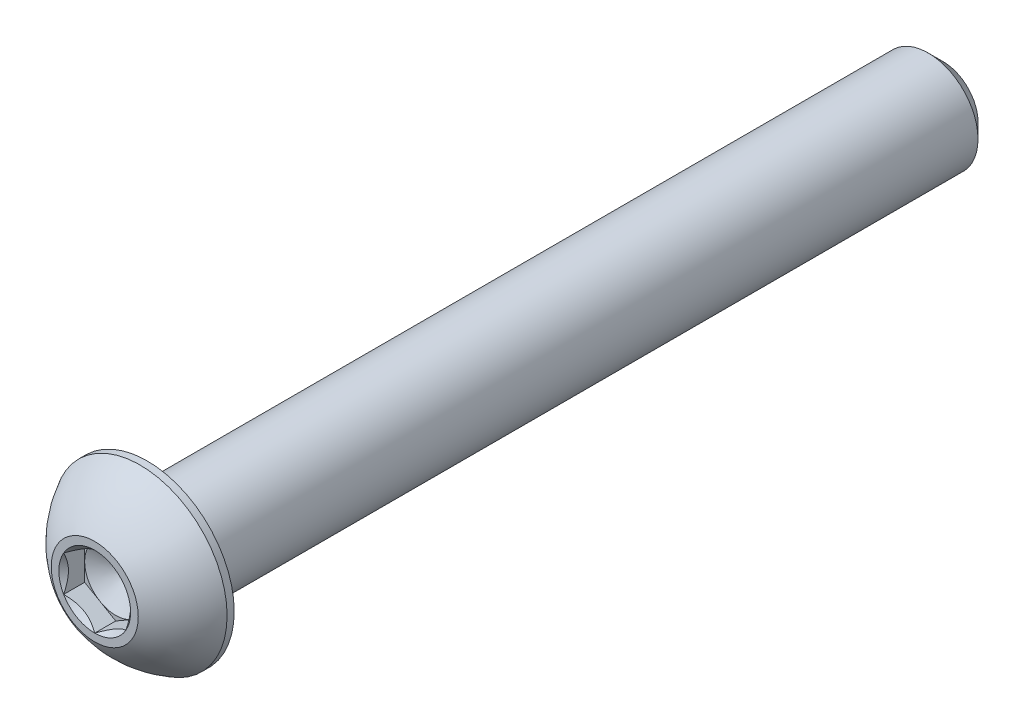
ISO-10303-21;
HEADER;
FILE_DESCRIPTION(('STEP AP214'),'2;1');
FILE_NAME('part.step','',(''),(''),'','','');
FILE_SCHEMA(('AUTOMOTIVE_DESIGN { 1 0 10303 214 1 1 1 1 }'));
ENDSEC;
DATA;
#1=APPLICATION_CONTEXT('core data for automotive mechanical design processes');
#2=APPLICATION_PROTOCOL_DEFINITION('international standard','automotive_design',2000,#1);
#3=PRODUCT_CONTEXT('',#1,'mechanical');
#4=PRODUCT('Part','Part','',(#3));
#5=PRODUCT_RELATED_PRODUCT_CATEGORY('part','',(#4));
#6=PRODUCT_DEFINITION_FORMATION('','',#4);
#7=PRODUCT_DEFINITION_CONTEXT('part definition',#1,'design');
#8=PRODUCT_DEFINITION('design','',#6,#7);
#9=PRODUCT_DEFINITION_SHAPE('','',#8);
#10=(LENGTH_UNIT() NAMED_UNIT(*) SI_UNIT(.MILLI.,.METRE.));
#11=(NAMED_UNIT(*) PLANE_ANGLE_UNIT() SI_UNIT($,.RADIAN.));
#12=(NAMED_UNIT(*) SI_UNIT($,.STERADIAN.) SOLID_ANGLE_UNIT());
#13=UNCERTAINTY_MEASURE_WITH_UNIT(LENGTH_MEASURE(1.E-05),#10,'distance_accuracy_value','');
#14=(GEOMETRIC_REPRESENTATION_CONTEXT(3) GLOBAL_UNCERTAINTY_ASSIGNED_CONTEXT((#13)) GLOBAL_UNIT_ASSIGNED_CONTEXT((#10,
#11,#12)) REPRESENTATION_CONTEXT('',''));
#15=CARTESIAN_POINT('',(0.,0.,0.));
#16=DIRECTION('',(0.,0.,1.));
#17=DIRECTION('',(1.,0.,0.));
#18=AXIS2_PLACEMENT_3D('',#15,#16,#17);
#19=CARTESIAN_POINT('',(0.,1.984375,27.0764));
#20=DIRECTION('',(0.,0.,-1.));
#21=DIRECTION('',(-1.,0.,0.));
#22=AXIS2_PLACEMENT_3D('',#19,#20,#21);
#23=PLANE('',#22);
#24=CARTESIAN_POINT('',(0.,0.,27.0764));
#25=DIRECTION('',(0.,0.,1.));
#26=DIRECTION('',(1.,0.,0.));
#27=AXIS2_PLACEMENT_3D('',#24,#25,#26);
#28=CIRCLE('',#27,2.778125);
#29=CARTESIAN_POINT('',(2.778125,0.,27.0764));
#30=VERTEX_POINT('',#29);
#31=EDGE_CURVE('E169',#30,#30,#28,.T.);
#32=ORIENTED_EDGE('',*,*,#31,.T.);
#33=EDGE_LOOP('',(#32));
#34=FACE_BOUND('',#33,.T.);
#35=CARTESIAN_POINT('',(0.,0.,27.0764));
#36=DIRECTION('',(0.,0.,1.));
#37=DIRECTION('',(1.,0.,0.));
#38=AXIS2_PLACEMENT_3D('',#35,#36,#37);
#39=CIRCLE('',#38,2.29135888084633);
#40=CARTESIAN_POINT('',(0.,2.29135888084633,27.0764));
#41=VERTEX_POINT('',#40);
#42=CARTESIAN_POINT('',(-1.984375,1.14567944042316,27.0764));
#43=VERTEX_POINT('',#42);
#44=EDGE_CURVE('E123',#41,#43,#39,.T.);
#45=ORIENTED_EDGE('',*,*,#44,.F.);
#46=CARTESIAN_POINT('',(0.,0.,27.0764));
#47=DIRECTION('',(0.,0.,1.));
#48=DIRECTION('',(1.,0.,0.));
#49=AXIS2_PLACEMENT_3D('',#46,#47,#48);
#50=CIRCLE('',#49,2.29135888084633);
#51=CARTESIAN_POINT('',(1.984375,1.14567944042317,27.0764));
#52=VERTEX_POINT('',#51);
#53=EDGE_CURVE('E108',#52,#41,#50,.T.);
#54=ORIENTED_EDGE('',*,*,#53,.F.);
#55=CARTESIAN_POINT('',(0.,0.,27.0764));
#56=DIRECTION('',(0.,0.,1.));
#57=DIRECTION('',(1.,0.,0.));
#58=AXIS2_PLACEMENT_3D('',#55,#56,#57);
#59=CIRCLE('',#58,2.29135888084633);
#60=CARTESIAN_POINT('',(1.984375,-1.14567944042317,27.0764));
#61=VERTEX_POINT('',#60);
#62=EDGE_CURVE('E119',#61,#52,#59,.T.);
#63=ORIENTED_EDGE('',*,*,#62,.F.);
#64=CARTESIAN_POINT('',(0.,0.,27.0764));
#65=DIRECTION('',(0.,0.,1.));
#66=DIRECTION('',(1.,0.,0.));
#67=AXIS2_PLACEMENT_3D('',#64,#65,#66);
#68=CIRCLE('',#67,2.29135888084633);
#69=CARTESIAN_POINT('',(0.,-2.29135888084633,27.0764));
#70=VERTEX_POINT('',#69);
#71=EDGE_CURVE('E140',#70,#61,#68,.T.);
#72=ORIENTED_EDGE('',*,*,#71,.F.);
#73=CARTESIAN_POINT('',(0.,0.,27.0764));
#74=DIRECTION('',(0.,0.,1.));
#75=DIRECTION('',(1.,0.,0.));
#76=AXIS2_PLACEMENT_3D('',#73,#74,#75);
#77=CIRCLE('',#76,2.29135888084633);
#78=CARTESIAN_POINT('',(-1.984375,-1.14567944042316,27.0764));
#79=VERTEX_POINT('',#78);
#80=EDGE_CURVE('E396',#79,#70,#77,.T.);
#81=ORIENTED_EDGE('',*,*,#80,.F.);
#82=CARTESIAN_POINT('',(0.,0.,27.0764));
#83=DIRECTION('',(0.,0.,1.));
#84=DIRECTION('',(1.,0.,0.));
#85=AXIS2_PLACEMENT_3D('',#82,#83,#84);
#86=CIRCLE('',#85,2.29135888084633);
#87=EDGE_CURVE('E405',#43,#79,#86,.T.);
#88=ORIENTED_EDGE('',*,*,#87,.F.);
#89=EDGE_LOOP('',(#45,#54,#63,#72,#81,#88));
#90=FACE_BOUND('',#89,.T.);
#91=ADVANCED_FACE('F35',(#34,#90),#23,.F.);
#92=CARTESIAN_POINT('',(0.,0.,-27.0764));
#93=DIRECTION('',(0.,0.,1.));
#94=DIRECTION('',(1.,0.,0.));
#95=AXIS2_PLACEMENT_3D('',#92,#93,#94);
#96=CONICAL_SURFACE('',#95,2.2225,0.785398163397447);
#97=CARTESIAN_POINT('',(0.,0.,-26.1239));
#98=DIRECTION('',(0.,0.,1.));
#99=DIRECTION('',(1.,0.,0.));
#100=AXIS2_PLACEMENT_3D('',#97,#98,#99);
#101=CIRCLE('',#100,3.175);
#102=CARTESIAN_POINT('',(3.175,0.,-26.1239));
#103=VERTEX_POINT('',#102);
#104=EDGE_CURVE('E11',#103,#103,#101,.T.);
#105=ORIENTED_EDGE('',*,*,#104,.F.);
#106=EDGE_LOOP('',(#105));
#107=FACE_BOUND('',#106,.T.);
#108=CARTESIAN_POINT('',(0.,0.,-27.0764));
#109=DIRECTION('',(0.,0.,1.));
#110=DIRECTION('',(1.,0.,0.));
#111=AXIS2_PLACEMENT_3D('',#108,#109,#110);
#112=CIRCLE('',#111,2.2225);
#113=CARTESIAN_POINT('',(2.2225,0.,-27.0764));
#114=VERTEX_POINT('',#113);
#115=EDGE_CURVE('E162',#114,#114,#112,.T.);
#116=ORIENTED_EDGE('',*,*,#115,.T.);
#117=EDGE_LOOP('',(#116));
#118=FACE_BOUND('',#117,.T.);
#119=ADVANCED_FACE('F37',(#107,#118),#96,.T.);
#120=CARTESIAN_POINT('',(0.,0.,27.0764));
#121=DIRECTION('',(0.,0.,1.));
#122=DIRECTION('',(1.,0.,0.));
#123=AXIS2_PLACEMENT_3D('',#120,#121,#122);
#124=CYLINDRICAL_SURFACE('',#123,3.175);
#125=CARTESIAN_POINT('',(0.,0.,23.7236));
#126=DIRECTION('',(0.,0.,1.));
#127=DIRECTION('',(1.,0.,0.));
#128=AXIS2_PLACEMENT_3D('',#125,#126,#127);
#129=CIRCLE('',#128,3.175);
#130=CARTESIAN_POINT('',(3.175,0.,23.7236));
#131=VERTEX_POINT('',#130);
#132=EDGE_CURVE('E43',#131,#131,#129,.T.);
#133=ORIENTED_EDGE('',*,*,#132,.F.);
#134=EDGE_LOOP('',(#133));
#135=FACE_BOUND('',#134,.T.);
#136=ORIENTED_EDGE('',*,*,#104,.T.);
#137=EDGE_LOOP('',(#136));
#138=FACE_BOUND('',#137,.T.);
#139=ADVANCED_FACE('F183',(#135,#138),#124,.T.);
#140=CARTESIAN_POINT('',(0.,5.5499,23.7236));
#141=DIRECTION('',(0.,0.,1.));
#142=DIRECTION('',(1.,0.,0.));
#143=AXIS2_PLACEMENT_3D('',#140,#141,#142);
#144=PLANE('',#143);
#145=CARTESIAN_POINT('',(0.,0.,23.7236));
#146=DIRECTION('',(0.,0.,1.));
#147=DIRECTION('',(1.,0.,0.));
#148=AXIS2_PLACEMENT_3D('',#145,#146,#147);
#149=CIRCLE('',#148,5.5499);
#150=CARTESIAN_POINT('',(5.5499,0.,23.7236));
#151=VERTEX_POINT('',#150);
#152=EDGE_CURVE('E176',#151,#151,#149,.T.);
#153=ORIENTED_EDGE('',*,*,#152,.F.);
#154=EDGE_LOOP('',(#153));
#155=FACE_BOUND('',#154,.T.);
#156=ORIENTED_EDGE('',*,*,#132,.T.);
#157=EDGE_LOOP('',(#156));
#158=FACE_BOUND('',#157,.T.);
#159=ADVANCED_FACE('F181',(#155,#158),#144,.F.);
#160=CARTESIAN_POINT('',(0.,0.,27.0764));
#161=DIRECTION('',(0.,0.,1.));
#162=DIRECTION('',(1.,0.,0.));
#163=AXIS2_PLACEMENT_3D('',#160,#161,#162);
#164=CYLINDRICAL_SURFACE('',#163,5.5499);
#165=CARTESIAN_POINT('',(0.,0.,24.1771714285714));
#166=DIRECTION('',(0.,0.,1.));
#167=DIRECTION('',(1.,0.,0.));
#168=AXIS2_PLACEMENT_3D('',#165,#166,#167);
#169=CIRCLE('',#168,5.5499);
#170=CARTESIAN_POINT('',(5.5499,0.,24.1771714285714));
#171=VERTEX_POINT('',#170);
#172=EDGE_CURVE('E173',#171,#171,#169,.T.);
#173=ORIENTED_EDGE('',*,*,#172,.F.);
#174=EDGE_LOOP('',(#173));
#175=FACE_BOUND('',#174,.T.);
#176=ORIENTED_EDGE('',*,*,#152,.T.);
#177=EDGE_LOOP('',(#176));
#178=FACE_BOUND('',#177,.T.);
#179=ADVANCED_FACE('F203',(#175,#178),#164,.T.);
#180=CARTESIAN_POINT('',(0.,0.,20.8835738300144));
#181=DIRECTION('',(0.,0.,1.));
#182=DIRECTION('',(1.,0.,0.));
#183=AXIS2_PLACEMENT_3D('',#180,#181,#182);
#184=DEGENERATE_TOROIDAL_SURFACE('',#183,0.797304856285753,7.15085971257149,.F.);
#185=ORIENTED_EDGE('',*,*,#31,.F.);
#186=EDGE_LOOP('',(#185));
#187=FACE_BOUND('',#186,.T.);
#188=ORIENTED_EDGE('',*,*,#172,.T.);
#189=EDGE_LOOP('',(#188));
#190=FACE_BOUND('',#189,.T.);
#191=ADVANCED_FACE('F194',(#187,#190),#184,.F.);
#192=CARTESIAN_POINT('',(0.,2.2225,-27.0764));
#193=DIRECTION('',(0.,0.,1.));
#194=DIRECTION('',(1.,0.,0.));
#195=AXIS2_PLACEMENT_3D('',#192,#193,#194);
#196=PLANE('',#195);
#197=ORIENTED_EDGE('',*,*,#115,.F.);
#198=EDGE_LOOP('',(#197));
#199=FACE_BOUND('',#198,.T.);
#200=ADVANCED_FACE('F192',(#199),#196,.F.);
#201=CARTESIAN_POINT('',(1.984375,1.14567944042317,27.0764));
#202=DIRECTION('',(-0.499999999999999,-0.866025403784439,0.));
#203=DIRECTION('',(0.866025403784439,-0.499999999999999,0.));
#204=AXIS2_PLACEMENT_3D('',#201,#202,#203);
#205=PLANE('',#204);
#206=CARTESIAN_POINT('',(1.984575,1.14556397036933,27.0765154787818));
#207=CARTESIAN_POINT('',(1.9163590048332,1.18494849354192,27.0371628522639));
#208=CARTESIAN_POINT('',(1.84700231489303,1.22499159714897,27.0001213104462));
#209=CARTESIAN_POINT('',(1.70557619954781,1.30664400291398,26.9322988584233));
#210=CARTESIAN_POINT('',(1.63349332126322,1.34826107209555,26.9015556890918));
#211=CARTESIAN_POINT('',(1.48814160273399,1.43217992591557,26.8488918888112));
#212=CARTESIAN_POINT('',(1.41490978751306,1.47446033414663,26.82683887588));
#213=CARTESIAN_POINT('',(1.26683381740529,1.55995203534886,26.7928614929439));
#214=CARTESIAN_POINT('',(1.19199418724658,1.60316071596705,26.7809117560917));
#215=CARTESIAN_POINT('',(1.06301458545618,1.6776271237807,26.7701300990819));
#216=CARTESIAN_POINT('',(1.00904128422756,1.7087886237741,26.7685338990591));
#217=CARTESIAN_POINT('',(0.901182881480199,1.77106070163465,26.7712218388653));
#218=CARTESIAN_POINT('',(0.847297817514476,1.80217125782056,26.7755080403405));
#219=CARTESIAN_POINT('',(0.740036461751395,1.86409863044402,26.7897168730135));
#220=CARTESIAN_POINT('',(0.686660807239859,1.89491507894443,26.7996458104523));
#221=CARTESIAN_POINT('',(0.580832482591103,1.95601509066827,26.8245950842745));
#222=CARTESIAN_POINT('',(0.528379742028898,1.9862986945516,26.8396150303895));
#223=CARTESIAN_POINT('',(0.394017661036351,2.06387267818152,26.8842078516357));
#224=CARTESIAN_POINT('',(0.312941642841675,2.11068193911104,26.9171429959383));
#225=CARTESIAN_POINT('',(0.193726693270159,2.17951072233758,26.9727424412022));
#226=CARTESIAN_POINT('',(0.154440075613997,2.20219286161692,26.9922775920519));
#227=CARTESIAN_POINT('',(0.0765946381319456,2.24713694590237,27.0331287381194));
#228=CARTESIAN_POINT('',(0.0380353888983002,2.26939913882716,27.0544436395683));
#229=CARTESIAN_POINT('',(-0.000200000000001396,2.29147435090016,27.0765154787818));
#230=B_SPLINE_CURVE_WITH_KNOTS('',3,(#206,#207,#208,#209,#210,#211,#212,#213,#214,#215,#216,
#217,#218,#219,#220,#221,#222,#223,#224,#225,#226,#227,#228,#229),.UNSPECIFIED.,.F.,.F.,(4,2,2,
2,2,2,2,2,2,2,2,4),(0.,0.264339630306627,0.530219665093694,0.791876416371458,1.05287424418109,
1.239639843932,1.42647091743852,1.61351120244034,1.8005371524754,2.09764209964316,
2.24579179873714,2.39385111134157),.UNSPECIFIED.);
#231=EDGE_CURVE('E105',#52,#41,#230,.T.);
#232=ORIENTED_EDGE('',*,*,#231,.T.);
#233=DIRECTION('',(0.,0.,-1.));
#234=VECTOR('',#233,1.);
#235=CARTESIAN_POINT('',(0.,2.29135888084633,27.0764));
#236=LINE('',#235,#234);
#237=CARTESIAN_POINT('',(0.,2.29135888084633,25.73528));
#238=VERTEX_POINT('',#237);
#239=EDGE_CURVE('E160',#41,#238,#236,.T.);
#240=ORIENTED_EDGE('',*,*,#239,.T.);
#241=DIRECTION('',(-0.866025403784439,0.499999999999999,0.));
#242=VECTOR('',#241,1.);
#243=CARTESIAN_POINT('',(1.984375,1.14567944042317,25.73528));
#244=LINE('',#243,#242);
#245=CARTESIAN_POINT('',(0.992187499999998,1.71851916063475,25.73528));
#246=VERTEX_POINT('',#245);
#247=EDGE_CURVE('E432',#246,#238,#244,.T.);
#248=ORIENTED_EDGE('',*,*,#247,.F.);
#249=CARTESIAN_POINT('',(1.984375,1.14567944042317,25.73528));
#250=VERTEX_POINT('',#249);
#251=EDGE_CURVE('E50',#250,#246,#244,.T.);
#252=ORIENTED_EDGE('',*,*,#251,.F.);
#253=DIRECTION('',(0.,0.,-1.));
#254=VECTOR('',#253,1.);
#255=CARTESIAN_POINT('',(1.984375,1.14567944042317,27.0764));
#256=LINE('',#255,#254);
#257=EDGE_CURVE('E136',#52,#250,#256,.T.);
#258=ORIENTED_EDGE('',*,*,#257,.F.);
#259=EDGE_LOOP('',(#232,#240,#248,#252,#258));
#260=FACE_BOUND('',#259,.T.);
#261=ADVANCED_FACE('F142',(#260),#205,.T.);
#262=CARTESIAN_POINT('',(0.,2.29135888084633,27.0764));
#263=DIRECTION('',(0.5,-0.866025403784438,0.));
#264=DIRECTION('',(0.866025403784438,0.5,0.));
#265=AXIS2_PLACEMENT_3D('',#262,#263,#264);
#266=PLANE('',#265);
#267=CARTESIAN_POINT('',(0.000199999999998332,2.29147435090016,27.0765154787818));
#268=CARTESIAN_POINT('',(-0.0680159951668041,2.25208982772757,27.0371628522639));
#269=CARTESIAN_POINT('',(-0.137372685106968,2.21204672412052,27.0001213104462));
#270=CARTESIAN_POINT('',(-0.278798800452189,2.13039431835551,26.9322988584233));
#271=CARTESIAN_POINT('',(-0.350881678736784,2.08877724917394,26.9015556890918));
#272=CARTESIAN_POINT('',(-0.496233397266005,2.00485839535392,26.8488918888112));
#273=CARTESIAN_POINT('',(-0.569465212486939,1.96257798712287,26.82683887588));
#274=CARTESIAN_POINT('',(-0.717541182594706,1.87708628592063,26.7928614929439));
#275=CARTESIAN_POINT('',(-0.792380812753424,1.83387760530244,26.7809117560917));
#276=CARTESIAN_POINT('',(-0.921360414543815,1.75941119748879,26.7701300990819));
#277=CARTESIAN_POINT('',(-0.975333715772442,1.72824969749539,26.7685338990591));
#278=CARTESIAN_POINT('',(-1.0831921185198,1.66597761963484,26.7712218388653));
#279=CARTESIAN_POINT('',(-1.13707718248552,1.63486706344893,26.7755080403405));
#280=CARTESIAN_POINT('',(-1.2443385382486,1.57293969082547,26.7897168730135));
#281=CARTESIAN_POINT('',(-1.29771419276014,1.54212324232506,26.7996458104523));
#282=CARTESIAN_POINT('',(-1.4035425174089,1.48102323060122,26.8245950842745));
#283=CARTESIAN_POINT('',(-1.4559952579711,1.45073962671789,26.8396150303895));
#284=CARTESIAN_POINT('',(-1.59035733896365,1.37316564308797,26.8842078516357));
#285=CARTESIAN_POINT('',(-1.67143335715832,1.32635638215845,26.9171429959383));
#286=CARTESIAN_POINT('',(-1.79064830672984,1.25752759893191,26.9727424412022));
#287=CARTESIAN_POINT('',(-1.829934924386,1.23484545965257,26.9922775920519));
#288=CARTESIAN_POINT('',(-1.90778036186805,1.18990137536712,27.0331287381194));
#289=CARTESIAN_POINT('',(-1.9463396111017,1.16763918244233,27.0544436395683));
#290=CARTESIAN_POINT('',(-1.984575,1.14556397036933,27.0765154787818));
#291=B_SPLINE_CURVE_WITH_KNOTS('',3,(#267,#268,#269,#270,#271,#272,#273,#274,#275,#276,#277,
#278,#279,#280,#281,#282,#283,#284,#285,#286,#287,#288,#289,#290),.UNSPECIFIED.,.F.,.F.,(4,2,2,
2,2,2,2,2,2,2,2,4),(0.,0.264339630306627,0.530219665093694,0.791876416371458,1.05287424418109,
1.239639843932,1.42647091743852,1.61351120244034,1.8005371524754,2.09764209964316,
2.24579179873714,2.39385111134157),.UNSPECIFIED.);
#292=EDGE_CURVE('E420',#41,#43,#291,.T.);
#293=ORIENTED_EDGE('',*,*,#292,.T.);
#294=DIRECTION('',(0.,0.,-1.));
#295=VECTOR('',#294,1.);
#296=CARTESIAN_POINT('',(-1.984375,1.14567944042316,27.0764));
#297=LINE('',#296,#295);
#298=CARTESIAN_POINT('',(-1.984375,1.14567944042316,25.73528));
#299=VERTEX_POINT('',#298);
#300=EDGE_CURVE('E157',#43,#299,#297,.T.);
#301=ORIENTED_EDGE('',*,*,#300,.T.);
#302=DIRECTION('',(-0.866025403784438,-0.5,0.));
#303=VECTOR('',#302,1.);
#304=CARTESIAN_POINT('',(0.,2.29135888084633,25.73528));
#305=LINE('',#304,#303);
#306=CARTESIAN_POINT('',(-0.992187500000001,1.71851916063475,25.73528));
#307=VERTEX_POINT('',#306);
#308=EDGE_CURVE('E434',#307,#299,#305,.T.);
#309=ORIENTED_EDGE('',*,*,#308,.F.);
#310=EDGE_CURVE('E435',#238,#307,#305,.T.);
#311=ORIENTED_EDGE('',*,*,#310,.F.);
#312=ORIENTED_EDGE('',*,*,#239,.F.);
#313=EDGE_LOOP('',(#293,#301,#309,#311,#312));
#314=FACE_BOUND('',#313,.T.);
#315=ADVANCED_FACE('F201',(#314),#266,.T.);
#316=CARTESIAN_POINT('',(-1.984375,1.14567944042316,27.0764));
#317=DIRECTION('',(1.,0.,0.));
#318=DIRECTION('',(0.,1.,0.));
#319=AXIS2_PLACEMENT_3D('',#316,#317,#318);
#320=PLANE('',#319);
#321=CARTESIAN_POINT('',(-1.984375,-2.24664989492636,27.7825700833169));
#322=CARTESIAN_POINT('',(-1.984375,-2.19177035879913,27.7414466992886));
#323=CARTESIAN_POINT('',(-1.984375,-2.1365793309425,27.7007329661326));
#324=CARTESIAN_POINT('',(-1.984375,-2.0254530694156,27.6203048670618));
#325=CARTESIAN_POINT('',(-1.984375,-1.96951764844329,27.5805907602265));
#326=CARTESIAN_POINT('',(-1.984375,-1.85637247000971,27.5020599960499));
#327=CARTESIAN_POINT('',(-1.984375,-1.79915619451491,27.4632526850202));
#328=CARTESIAN_POINT('',(-1.984375,-1.68374612486123,27.3871311665578));
#329=CARTESIAN_POINT('',(-1.984375,-1.62555240093272,27.3498168524981));
#330=CARTESIAN_POINT('',(-1.984375,-1.44283684202776,27.236567942359));
#331=CARTESIAN_POINT('',(-1.984375,-1.31636516124235,27.1637214191006));
#332=CARTESIAN_POINT('',(-1.984375,-1.05716498260296,27.0307117557776));
#333=CARTESIAN_POINT('',(-1.984375,-0.924459462264121,26.9705059196546));
#334=CARTESIAN_POINT('',(-1.984375,-0.724893074141588,26.8968618396154));
#335=CARTESIAN_POINT('',(-1.984375,-0.660907572248813,26.8756629174856));
#336=CARTESIAN_POINT('',(-1.984375,-0.531425551080248,26.8384071147974));
#337=CARTESIAN_POINT('',(-1.984375,-0.465928924835295,26.8223505994633));
#338=CARTESIAN_POINT('',(-1.984375,-0.334891945890406,26.7964708434592));
#339=CARTESIAN_POINT('',(-1.984375,-0.269372555502922,26.7865431015484));
#340=CARTESIAN_POINT('',(-1.984375,-0.137675185771462,26.7731085903106));
#341=CARTESIAN_POINT('',(-1.984375,-0.0714973135780643,26.7696007929468));
#342=CARTESIAN_POINT('',(-1.984375,0.0586431546448469,26.7692516482374));
#343=CARTESIAN_POINT('',(-1.984375,0.122605247687117,26.7721896245911));
#344=CARTESIAN_POINT('',(-1.984375,0.249962419599663,26.7840917091826));
#345=CARTESIAN_POINT('',(-1.984375,0.31335744162457,26.7930564148524));
#346=CARTESIAN_POINT('',(-1.984375,0.440194078343454,26.8166811503476));
#347=CARTESIAN_POINT('',(-1.984375,0.503617615772963,26.8314367997364));
#348=CARTESIAN_POINT('',(-1.984375,0.629083701047628,26.8658707574727));
#349=CARTESIAN_POINT('',(-1.984375,0.691126376772748,26.885548607898));
#350=CARTESIAN_POINT('',(-1.984375,0.888252191671363,26.9554251863326));
#351=CARTESIAN_POINT('',(-1.984375,1.02048040542615,27.0136555893404));
#352=CARTESIAN_POINT('',(-1.984375,1.27871806100267,27.1430691802767));
#353=CARTESIAN_POINT('',(-1.984375,1.40470281207756,27.2142992719574));
#354=CARTESIAN_POINT('',(-1.984375,1.5867785992022,27.3254129319412));
#355=CARTESIAN_POINT('',(-1.984375,1.64484387516129,27.3621238248926));
#356=CARTESIAN_POINT('',(-1.984375,1.75997827817988,27.4370874476375));
#357=CARTESIAN_POINT('',(-1.984375,1.81704732901583,27.4753402946748));
#358=CARTESIAN_POINT('',(-1.984375,1.92985499213403,27.5527867819938));
#359=CARTESIAN_POINT('',(-1.984375,1.98560066211377,27.5919701932287));
#360=CARTESIAN_POINT('',(-1.984375,2.09633159947626,27.6713666099261));
#361=CARTESIAN_POINT('',(-1.984375,2.15131707145808,27.7115793297131));
#362=CARTESIAN_POINT('',(-1.984375,2.20598450458982,27.75221347261));
#363=B_SPLINE_CURVE_WITH_KNOTS('',3,(#321,#322,#323,#324,#325,#326,#327,#328,#329,#330,#331,
#332,#333,#334,#335,#336,#337,#338,#339,#340,#341,#342,#343,#344,#345,#346,#347,#348,#349,#350,
#351,#352,#353,#354,#355,#356,#357,#358,#359,#360,#361,#362),.UNSPECIFIED.,.F.,.F.,(4,2,2,2,2,2,
2,2,2,2,2,2,2,2,2,2,2,2,2,2,4),(0.,0.205736210356767,0.411525204809811,0.618909845914798,
0.826279649489808,1.26374370453551,1.69970549535382,1.90175047418286,2.10380979948048,
2.30232110479859,2.50080061937433,2.69259135253523,2.88440110079441,3.07952109080018,
3.27462293514803,3.70679897011888,4.14056631296021,4.34663769336142,4.552724772271,
4.75712951108819,4.96147812147717),.UNSPECIFIED.);
#364=EDGE_CURVE('E413',#43,#79,#363,.F.);
#365=ORIENTED_EDGE('',*,*,#364,.T.);
#366=DIRECTION('',(0.,0.,-1.));
#367=VECTOR('',#366,1.);
#368=CARTESIAN_POINT('',(-1.984375,-1.14567944042316,27.0764));
#369=LINE('',#368,#367);
#370=CARTESIAN_POINT('',(-1.984375,-1.14567944042316,25.73528));
#371=VERTEX_POINT('',#370);
#372=EDGE_CURVE('E154',#79,#371,#369,.T.);
#373=ORIENTED_EDGE('',*,*,#372,.T.);
#374=DIRECTION('',(0.,-1.,0.));
#375=VECTOR('',#374,1.);
#376=CARTESIAN_POINT('',(-1.984375,1.14567944042316,25.73528));
#377=LINE('',#376,#375);
#378=CARTESIAN_POINT('',(-1.984375,0.,25.73528));
#379=VERTEX_POINT('',#378);
#380=EDGE_CURVE('E438',#379,#371,#377,.T.);
#381=ORIENTED_EDGE('',*,*,#380,.F.);
#382=EDGE_CURVE('E439',#299,#379,#377,.T.);
#383=ORIENTED_EDGE('',*,*,#382,.F.);
#384=ORIENTED_EDGE('',*,*,#300,.F.);
#385=EDGE_LOOP('',(#365,#373,#381,#383,#384));
#386=FACE_BOUND('',#385,.T.);
#387=ADVANCED_FACE('F256',(#386),#320,.T.);
#388=CARTESIAN_POINT('',(-1.984375,-1.14567944042316,27.0764));
#389=DIRECTION('',(0.5,0.866025403784439,0.));
#390=DIRECTION('',(-0.866025403784439,0.5,0.));
#391=AXIS2_PLACEMENT_3D('',#388,#389,#390);
#392=PLANE('',#391);
#393=CARTESIAN_POINT('',(-1.984575,-1.14556397036932,27.0765154787818));
#394=CARTESIAN_POINT('',(-1.9163590048332,-1.18494849354192,27.0371628522639));
#395=CARTESIAN_POINT('',(-1.84700231489303,-1.22499159714897,27.0001213104462));
#396=CARTESIAN_POINT('',(-1.70557619954781,-1.30664400291398,26.9322988584233));
#397=CARTESIAN_POINT('',(-1.63349332126322,-1.34826107209555,26.9015556890918));
#398=CARTESIAN_POINT('',(-1.48814160273399,-1.43217992591557,26.8488918888112));
#399=CARTESIAN_POINT('',(-1.41490978751306,-1.47446033414662,26.82683887588));
#400=CARTESIAN_POINT('',(-1.26683381740529,-1.55995203534886,26.7928614929439));
#401=CARTESIAN_POINT('',(-1.19199418724657,-1.60316071596705,26.7809117560917));
#402=CARTESIAN_POINT('',(-1.06301458545618,-1.6776271237807,26.7701300990819));
#403=CARTESIAN_POINT('',(-1.00904128422755,-1.7087886237741,26.7685338990591));
#404=CARTESIAN_POINT('',(-0.901182881480196,-1.77106070163465,26.7712218388653));
#405=CARTESIAN_POINT('',(-0.847297817514473,-1.80217125782056,26.7755080403405));
#406=CARTESIAN_POINT('',(-0.740036461751392,-1.86409863044402,26.7897168730135));
#407=CARTESIAN_POINT('',(-0.686660807239856,-1.89491507894443,26.7996458104523));
#408=CARTESIAN_POINT('',(-0.5808324825911,-1.95601509066827,26.8245950842745));
#409=CARTESIAN_POINT('',(-0.528379742028895,-1.9862986945516,26.8396150303895));
#410=CARTESIAN_POINT('',(-0.394017661036349,-2.06387267818152,26.8842078516357));
#411=CARTESIAN_POINT('',(-0.312941642841673,-2.11068193911104,26.9171429959383));
#412=CARTESIAN_POINT('',(-0.193726693270159,-2.17951072233758,26.9727424412022));
#413=CARTESIAN_POINT('',(-0.154440075613998,-2.20219286161692,26.9922775920519));
#414=CARTESIAN_POINT('',(-0.0765946381319472,-2.24713694590236,27.0331287381194));
#415=CARTESIAN_POINT('',(-0.0380353888983016,-2.26939913882716,27.0544436395683));
#416=CARTESIAN_POINT('',(0.000200000000000158,-2.29147435090016,27.0765154787818));
#417=B_SPLINE_CURVE_WITH_KNOTS('',3,(#393,#394,#395,#396,#397,#398,#399,#400,#401,#402,#403,
#404,#405,#406,#407,#408,#409,#410,#411,#412,#413,#414,#415,#416),.UNSPECIFIED.,.F.,.F.,(4,2,2,
2,2,2,2,2,2,2,2,4),(0.,0.264339630306627,0.530219665093696,0.791876416371463,1.0528742441811,
1.23963984393201,1.42647091743853,1.61351120244035,1.80053715247541,2.09764209964316,
2.24579179873714,2.39385111134157),.UNSPECIFIED.);
#418=EDGE_CURVE('E398',#79,#70,#417,.T.);
#419=ORIENTED_EDGE('',*,*,#418,.T.);
#420=DIRECTION('',(0.,0.,-1.));
#421=VECTOR('',#420,1.);
#422=CARTESIAN_POINT('',(0.,-2.29135888084632,27.0764));
#423=LINE('',#422,#421);
#424=CARTESIAN_POINT('',(0.,-2.29135888084632,25.73528));
#425=VERTEX_POINT('',#424);
#426=EDGE_CURVE('E145',#70,#425,#423,.T.);
#427=ORIENTED_EDGE('',*,*,#426,.T.);
#428=DIRECTION('',(0.866025403784439,-0.5,0.));
#429=VECTOR('',#428,1.);
#430=CARTESIAN_POINT('',(-1.984375,-1.14567944042316,25.73528));
#431=LINE('',#430,#429);
#432=CARTESIAN_POINT('',(-0.992187499999998,-1.71851916063474,25.73528));
#433=VERTEX_POINT('',#432);
#434=EDGE_CURVE('E442',#433,#425,#431,.T.);
#435=ORIENTED_EDGE('',*,*,#434,.F.);
#436=EDGE_CURVE('E443',#371,#433,#431,.T.);
#437=ORIENTED_EDGE('',*,*,#436,.F.);
#438=ORIENTED_EDGE('',*,*,#372,.F.);
#439=EDGE_LOOP('',(#419,#427,#435,#437,#438));
#440=FACE_BOUND('',#439,.T.);
#441=ADVANCED_FACE('F264',(#440),#392,.T.);
#442=CARTESIAN_POINT('',(0.,-2.29135888084632,27.0764));
#443=DIRECTION('',(-0.5,0.866025403784438,0.));
#444=DIRECTION('',(-0.866025403784438,-0.5,0.));
#445=AXIS2_PLACEMENT_3D('',#442,#443,#444);
#446=PLANE('',#445);
#447=CARTESIAN_POINT('',(-0.000199999999999107,-2.29147435090016,27.0765154787818));
#448=CARTESIAN_POINT('',(0.0680159951668038,-2.25208982772757,27.0371628522639));
#449=CARTESIAN_POINT('',(0.137372685106967,-2.21204672412052,27.0001213104462));
#450=CARTESIAN_POINT('',(0.278798800452189,-2.13039431835551,26.9322988584233));
#451=CARTESIAN_POINT('',(0.350881678736783,-2.08877724917393,26.9015556890917));
#452=CARTESIAN_POINT('',(0.496233397266004,-2.00485839535391,26.8488918888112));
#453=CARTESIAN_POINT('',(0.569465212486938,-1.96257798712286,26.82683887588));
#454=CARTESIAN_POINT('',(0.717541182594705,-1.87708628592063,26.7928614929439));
#455=CARTESIAN_POINT('',(0.792380812753422,-1.83387760530244,26.7809117560917));
#456=CARTESIAN_POINT('',(0.921360414543812,-1.75941119748879,26.7701300990819));
#457=CARTESIAN_POINT('',(0.975333715772439,-1.72824969749539,26.7685338990591));
#458=CARTESIAN_POINT('',(1.0831921185198,-1.66597761963484,26.7712218388653));
#459=CARTESIAN_POINT('',(1.13707718248552,-1.63486706344893,26.7755080403405));
#460=CARTESIAN_POINT('',(1.2443385382486,-1.57293969082547,26.7897168730135));
#461=CARTESIAN_POINT('',(1.29771419276014,-1.54212324232506,26.7996458104523));
#462=CARTESIAN_POINT('',(1.40354251740889,-1.48102323060121,26.8245950842745));
#463=CARTESIAN_POINT('',(1.4559952579711,-1.45073962671789,26.8396150303895));
#464=CARTESIAN_POINT('',(1.59035733896364,-1.37316564308797,26.8842078516357));
#465=CARTESIAN_POINT('',(1.67143335715832,-1.32635638215845,26.9171429959383));
#466=CARTESIAN_POINT('',(1.79064830672984,-1.2575275989319,26.9727424412022));
#467=CARTESIAN_POINT('',(1.829934924386,-1.23484545965257,26.9922775920519));
#468=CARTESIAN_POINT('',(1.90778036186805,-1.18990137536712,27.0331287381194));
#469=CARTESIAN_POINT('',(1.9463396111017,-1.16763918244233,27.0544436395683));
#470=CARTESIAN_POINT('',(1.984575,-1.14556397036932,27.0765154787818));
#471=B_SPLINE_CURVE_WITH_KNOTS('',3,(#447,#448,#449,#450,#451,#452,#453,#454,#455,#456,#457,
#458,#459,#460,#461,#462,#463,#464,#465,#466,#467,#468,#469,#470),.UNSPECIFIED.,.F.,.F.,(4,2,2,
2,2,2,2,2,2,2,2,4),(0.,0.264339630306628,0.530219665093694,0.791876416371458,1.05287424418109,
1.239639843932,1.42647091743852,1.61351120244034,1.8005371524754,2.09764209964316,
2.24579179873713,2.39385111134157),.UNSPECIFIED.);
#472=EDGE_CURVE('E389',#70,#61,#471,.T.);
#473=ORIENTED_EDGE('',*,*,#472,.T.);
#474=DIRECTION('',(0.,0.,-1.));
#475=VECTOR('',#474,1.);
#476=CARTESIAN_POINT('',(1.984375,-1.14567944042316,27.0764));
#477=LINE('',#476,#475);
#478=CARTESIAN_POINT('',(1.984375,-1.14567944042316,25.73528));
#479=VERTEX_POINT('',#478);
#480=EDGE_CURVE('E139',#61,#479,#477,.T.);
#481=ORIENTED_EDGE('',*,*,#480,.T.);
#482=DIRECTION('',(0.866025403784438,0.5,0.));
#483=VECTOR('',#482,1.);
#484=CARTESIAN_POINT('',(0.,-2.29135888084632,25.73528));
#485=LINE('',#484,#483);
#486=CARTESIAN_POINT('',(0.992187499999999,-1.71851916063474,25.73528));
#487=VERTEX_POINT('',#486);
#488=EDGE_CURVE('E445',#487,#479,#485,.T.);
#489=ORIENTED_EDGE('',*,*,#488,.F.);
#490=EDGE_CURVE('E446',#425,#487,#485,.T.);
#491=ORIENTED_EDGE('',*,*,#490,.F.);
#492=ORIENTED_EDGE('',*,*,#426,.F.);
#493=EDGE_LOOP('',(#473,#481,#489,#491,#492));
#494=FACE_BOUND('',#493,.T.);
#495=ADVANCED_FACE('F272',(#494),#446,.T.);
#496=CARTESIAN_POINT('',(1.984375,-1.14567944042316,27.0764));
#497=DIRECTION('',(-1.,0.,0.));
#498=DIRECTION('',(0.,-1.,0.));
#499=AXIS2_PLACEMENT_3D('',#496,#497,#498);
#500=PLANE('',#499);
#501=CARTESIAN_POINT('',(1.984375,-2.24664989492635,27.7825700833169));
#502=CARTESIAN_POINT('',(1.984375,-2.19177035879913,27.7414466992886));
#503=CARTESIAN_POINT('',(1.984375,-2.1365793309425,27.7007329661326));
#504=CARTESIAN_POINT('',(1.984375,-2.0254530694156,27.6203048670617));
#505=CARTESIAN_POINT('',(1.984375,-1.96951764844329,27.5805907602265));
#506=CARTESIAN_POINT('',(1.984375,-1.85637247000971,27.5020599960499));
#507=CARTESIAN_POINT('',(1.984375,-1.79915619451491,27.4632526850202));
#508=CARTESIAN_POINT('',(1.984375,-1.68374612486123,27.3871311665578));
#509=CARTESIAN_POINT('',(1.984375,-1.62555240093272,27.3498168524981));
#510=CARTESIAN_POINT('',(1.984375,-1.44283684202776,27.236567942359));
#511=CARTESIAN_POINT('',(1.984375,-1.31636516124235,27.1637214191006));
#512=CARTESIAN_POINT('',(1.984375,-1.05716498260296,27.0307117557776));
#513=CARTESIAN_POINT('',(1.984375,-0.92445946226412,26.9705059196546));
#514=CARTESIAN_POINT('',(1.984375,-0.724893074141585,26.8968618396154));
#515=CARTESIAN_POINT('',(1.984375,-0.66090757224881,26.8756629174856));
#516=CARTESIAN_POINT('',(1.984375,-0.531425551080244,26.8384071147974));
#517=CARTESIAN_POINT('',(1.984375,-0.465928924835292,26.8223505994633));
#518=CARTESIAN_POINT('',(1.984375,-0.334891945890403,26.7964708434592));
#519=CARTESIAN_POINT('',(1.984375,-0.269372555502919,26.7865431015484));
#520=CARTESIAN_POINT('',(1.984375,-0.137675185771459,26.7731085903106));
#521=CARTESIAN_POINT('',(1.984375,-0.0714973135780618,26.7696007929468));
#522=CARTESIAN_POINT('',(1.984375,0.0586431546448493,26.7692516482373));
#523=CARTESIAN_POINT('',(1.984375,0.12260524768712,26.7721896245911));
#524=CARTESIAN_POINT('',(1.984375,0.249962419599665,26.7840917091826));
#525=CARTESIAN_POINT('',(1.984375,0.313357441624572,26.7930564148524));
#526=CARTESIAN_POINT('',(1.984375,0.440194078343456,26.8166811503476));
#527=CARTESIAN_POINT('',(1.984375,0.503617615772965,26.8314367997364));
#528=CARTESIAN_POINT('',(1.984375,0.62908370104763,26.8658707574727));
#529=CARTESIAN_POINT('',(1.984375,0.691126376772749,26.885548607898));
#530=CARTESIAN_POINT('',(1.984375,0.888252191671363,26.9554251863326));
#531=CARTESIAN_POINT('',(1.984375,1.02048040542614,27.0136555893404));
#532=CARTESIAN_POINT('',(1.984375,1.27871806100267,27.1430691802767));
#533=CARTESIAN_POINT('',(1.984375,1.40470281207756,27.2142992719574));
#534=CARTESIAN_POINT('',(1.984375,1.5867785992022,27.3254129319412));
#535=CARTESIAN_POINT('',(1.984375,1.64484387516129,27.3621238248926));
#536=CARTESIAN_POINT('',(1.984375,1.75997827817988,27.4370874476375));
#537=CARTESIAN_POINT('',(1.984375,1.81704732901584,27.4753402946748));
#538=CARTESIAN_POINT('',(1.984375,1.92985499213404,27.5527867819938));
#539=CARTESIAN_POINT('',(1.984375,1.98560066211378,27.5919701932287));
#540=CARTESIAN_POINT('',(1.984375,2.09633159947627,27.6713666099261));
#541=CARTESIAN_POINT('',(1.984375,2.15131707145809,27.7115793297131));
#542=CARTESIAN_POINT('',(1.984375,2.20598450458983,27.75221347261));
#543=B_SPLINE_CURVE_WITH_KNOTS('',3,(#501,#502,#503,#504,#505,#506,#507,#508,#509,#510,#511,
#512,#513,#514,#515,#516,#517,#518,#519,#520,#521,#522,#523,#524,#525,#526,#527,#528,#529,#530,
#531,#532,#533,#534,#535,#536,#537,#538,#539,#540,#541,#542),.UNSPECIFIED.,.F.,.F.,(4,2,2,2,2,2,
2,2,2,2,2,2,2,2,2,2,2,2,2,2,4),(0.,0.205736210356763,0.411525204809806,0.618909845914794,
0.826279649489806,1.2637437045355,1.69970549535382,1.90175047418286,2.10380979948048,
2.30232110479859,2.50080061937432,2.69259135253523,2.88440110079441,3.07952109080017,
3.27462293514802,3.70679897011888,4.14056631296021,4.34663769336142,4.552724772271,
4.75712951108819,4.96147812147718),.UNSPECIFIED.);
#544=EDGE_CURVE('E129',#61,#52,#543,.T.);
#545=ORIENTED_EDGE('',*,*,#544,.T.);
#546=ORIENTED_EDGE('',*,*,#257,.T.);
#547=DIRECTION('',(0.,1.,0.));
#548=VECTOR('',#547,1.);
#549=CARTESIAN_POINT('',(1.984375,-1.14567944042316,25.73528));
#550=LINE('',#549,#548);
#551=CARTESIAN_POINT('',(1.984375,0.,25.73528));
#552=VERTEX_POINT('',#551);
#553=EDGE_CURVE('E148',#552,#250,#550,.T.);
#554=ORIENTED_EDGE('',*,*,#553,.F.);
#555=EDGE_CURVE('E143',#479,#552,#550,.T.);
#556=ORIENTED_EDGE('',*,*,#555,.F.);
#557=ORIENTED_EDGE('',*,*,#480,.F.);
#558=EDGE_LOOP('',(#545,#546,#554,#556,#557));
#559=FACE_BOUND('',#558,.T.);
#560=ADVANCED_FACE('F134',(#559),#500,.T.);
#561=CARTESIAN_POINT('',(0.,0.,25.73528));
#562=DIRECTION('',(0.,0.,1.));
#563=DIRECTION('',(1.,0.,0.));
#564=AXIS2_PLACEMENT_3D('',#561,#562,#563);
#565=PLANE('',#564);
#566=CARTESIAN_POINT('',(0.,0.,25.73528));
#567=DIRECTION('',(0.,0.,1.));
#568=DIRECTION('',(1.,0.,0.));
#569=AXIS2_PLACEMENT_3D('',#566,#567,#568);
#570=CIRCLE('',#569,1.984375);
#571=EDGE_CURVE('E165',#487,#552,#570,.T.);
#572=ORIENTED_EDGE('',*,*,#571,.F.);
#573=ORIENTED_EDGE('',*,*,#488,.T.);
#574=ORIENTED_EDGE('',*,*,#555,.T.);
#575=EDGE_LOOP('',(#572,#573,#574));
#576=FACE_BOUND('',#575,.T.);
#577=ADVANCED_FACE('F287',(#576),#565,.T.);
#578=EDGE_CURVE('E458',#433,#487,#570,.T.);
#579=ORIENTED_EDGE('',*,*,#578,.F.);
#580=ORIENTED_EDGE('',*,*,#434,.T.);
#581=ORIENTED_EDGE('',*,*,#490,.T.);
#582=EDGE_LOOP('',(#579,#580,#581));
#583=FACE_BOUND('',#582,.T.);
#584=ADVANCED_FACE('F294',(#583),#565,.T.);
#585=EDGE_CURVE('E459',#379,#433,#570,.T.);
#586=ORIENTED_EDGE('',*,*,#585,.F.);
#587=ORIENTED_EDGE('',*,*,#380,.T.);
#588=ORIENTED_EDGE('',*,*,#436,.T.);
#589=EDGE_LOOP('',(#586,#587,#588));
#590=FACE_BOUND('',#589,.T.);
#591=ADVANCED_FACE('F302',(#590),#565,.T.);
#592=EDGE_CURVE('E460',#307,#379,#570,.T.);
#593=ORIENTED_EDGE('',*,*,#592,.F.);
#594=ORIENTED_EDGE('',*,*,#308,.T.);
#595=ORIENTED_EDGE('',*,*,#382,.T.);
#596=EDGE_LOOP('',(#593,#594,#595));
#597=FACE_BOUND('',#596,.T.);
#598=ADVANCED_FACE('F309',(#597),#565,.T.);
#599=EDGE_CURVE('E170',#246,#307,#570,.T.);
#600=ORIENTED_EDGE('',*,*,#599,.F.);
#601=ORIENTED_EDGE('',*,*,#247,.T.);
#602=ORIENTED_EDGE('',*,*,#310,.T.);
#603=EDGE_LOOP('',(#600,#601,#602));
#604=FACE_BOUND('',#603,.T.);
#605=ADVANCED_FACE('F316',(#604),#565,.T.);
#606=EDGE_CURVE('E166',#552,#246,#570,.T.);
#607=ORIENTED_EDGE('',*,*,#606,.F.);
#608=ORIENTED_EDGE('',*,*,#553,.T.);
#609=ORIENTED_EDGE('',*,*,#251,.T.);
#610=EDGE_LOOP('',(#607,#608,#609));
#611=FACE_BOUND('',#610,.T.);
#612=ADVANCED_FACE('F240',(#611),#565,.T.);
#613=CARTESIAN_POINT('',(0.,0.,25.73528));
#614=DIRECTION('',(0.,0.,1.));
#615=DIRECTION('',(1.,0.,0.));
#616=AXIS2_PLACEMENT_3D('',#613,#614,#615);
#617=CONICAL_SURFACE('',#616,1.984375,1.0471975511966);
#618=CARTESIAN_POINT('',(0.,0.,24.5896005595768));
#619=VERTEX_POINT('',#618);
#620=VERTEX_LOOP('',#619);
#621=FACE_BOUND('',#620,.T.);
#622=ORIENTED_EDGE('',*,*,#606,.T.);
#623=ORIENTED_EDGE('',*,*,#599,.T.);
#624=ORIENTED_EDGE('',*,*,#592,.T.);
#625=ORIENTED_EDGE('',*,*,#585,.T.);
#626=ORIENTED_EDGE('',*,*,#578,.T.);
#627=ORIENTED_EDGE('',*,*,#571,.T.);
#628=EDGE_LOOP('',(#622,#623,#624,#625,#626,#627));
#629=FACE_BOUND('',#628,.T.);
#630=ADVANCED_FACE('F213',(#621,#629),#617,.F.);
#631=CARTESIAN_POINT('',(0.,0.,27.0764));
#632=DIRECTION('',(0.,0.,1.));
#633=DIRECTION('',(1.,0.,0.));
#634=AXIS2_PLACEMENT_3D('',#631,#632,#633);
#635=CONICAL_SURFACE('',#634,2.29135888084633,0.78539816339745);
#636=ORIENTED_EDGE('',*,*,#44,.T.);
#637=ORIENTED_EDGE('',*,*,#292,.F.);
#638=EDGE_LOOP('',(#636,#637));
#639=FACE_BOUND('',#638,.T.);
#640=ADVANCED_FACE('F239',(#639),#635,.F.);
#641=CARTESIAN_POINT('',(0.,0.,27.0764));
#642=DIRECTION('',(0.,0.,1.));
#643=DIRECTION('',(1.,0.,0.));
#644=AXIS2_PLACEMENT_3D('',#641,#642,#643);
#645=CONICAL_SURFACE('',#644,2.29135888084633,0.78539816339745);
#646=ORIENTED_EDGE('',*,*,#87,.T.);
#647=ORIENTED_EDGE('',*,*,#364,.F.);
#648=EDGE_LOOP('',(#646,#647));
#649=FACE_BOUND('',#648,.T.);
#650=ADVANCED_FACE('F332',(#649),#645,.F.);
#651=CARTESIAN_POINT('',(0.,0.,27.0764));
#652=DIRECTION('',(0.,0.,1.));
#653=DIRECTION('',(1.,0.,0.));
#654=AXIS2_PLACEMENT_3D('',#651,#652,#653);
#655=CONICAL_SURFACE('',#654,2.29135888084633,0.78539816339745);
#656=ORIENTED_EDGE('',*,*,#80,.T.);
#657=ORIENTED_EDGE('',*,*,#418,.F.);
#658=EDGE_LOOP('',(#656,#657));
#659=FACE_BOUND('',#658,.T.);
#660=ADVANCED_FACE('F340',(#659),#655,.F.);
#661=CARTESIAN_POINT('',(0.,0.,27.0764));
#662=DIRECTION('',(0.,0.,1.));
#663=DIRECTION('',(1.,0.,0.));
#664=AXIS2_PLACEMENT_3D('',#661,#662,#663);
#665=CONICAL_SURFACE('',#664,2.29135888084633,0.78539816339745);
#666=ORIENTED_EDGE('',*,*,#71,.T.);
#667=ORIENTED_EDGE('',*,*,#472,.F.);
#668=EDGE_LOOP('',(#666,#667));
#669=FACE_BOUND('',#668,.T.);
#670=ADVANCED_FACE('F348',(#669),#665,.F.);
#671=CARTESIAN_POINT('',(0.,0.,27.0764));
#672=DIRECTION('',(0.,0.,1.));
#673=DIRECTION('',(1.,0.,0.));
#674=AXIS2_PLACEMENT_3D('',#671,#672,#673);
#675=CONICAL_SURFACE('',#674,2.29135888084633,0.78539816339745);
#676=ORIENTED_EDGE('',*,*,#62,.T.);
#677=ORIENTED_EDGE('',*,*,#544,.F.);
#678=EDGE_LOOP('',(#676,#677));
#679=FACE_BOUND('',#678,.T.);
#680=ADVANCED_FACE('F128',(#679),#675,.F.);
#681=CARTESIAN_POINT('',(0.,0.,27.0764));
#682=DIRECTION('',(0.,0.,1.));
#683=DIRECTION('',(1.,0.,0.));
#684=AXIS2_PLACEMENT_3D('',#681,#682,#683);
#685=CONICAL_SURFACE('',#684,2.29135888084633,0.78539816339745);
#686=ORIENTED_EDGE('',*,*,#53,.T.);
#687=ORIENTED_EDGE('',*,*,#231,.F.);
#688=EDGE_LOOP('',(#686,#687));
#689=FACE_BOUND('',#688,.T.);
#690=ADVANCED_FACE('F107',(#689),#685,.F.);
#691=CLOSED_SHELL('',(#91,#119,#139,#159,#179,#191,#200,#261,#315,#387,#441,#495,#560,#577,#584,
#591,#598,#605,#612,#630,#640,#650,#660,#670,#680,#690));
#692=MANIFOLD_SOLID_BREP('B2',#691);
#693=ADVANCED_BREP_SHAPE_REPRESENTATION('',(#18,#692),#14);
#694=SHAPE_DEFINITION_REPRESENTATION(#9,#693);
ENDSEC;
END-ISO-10303-21;
